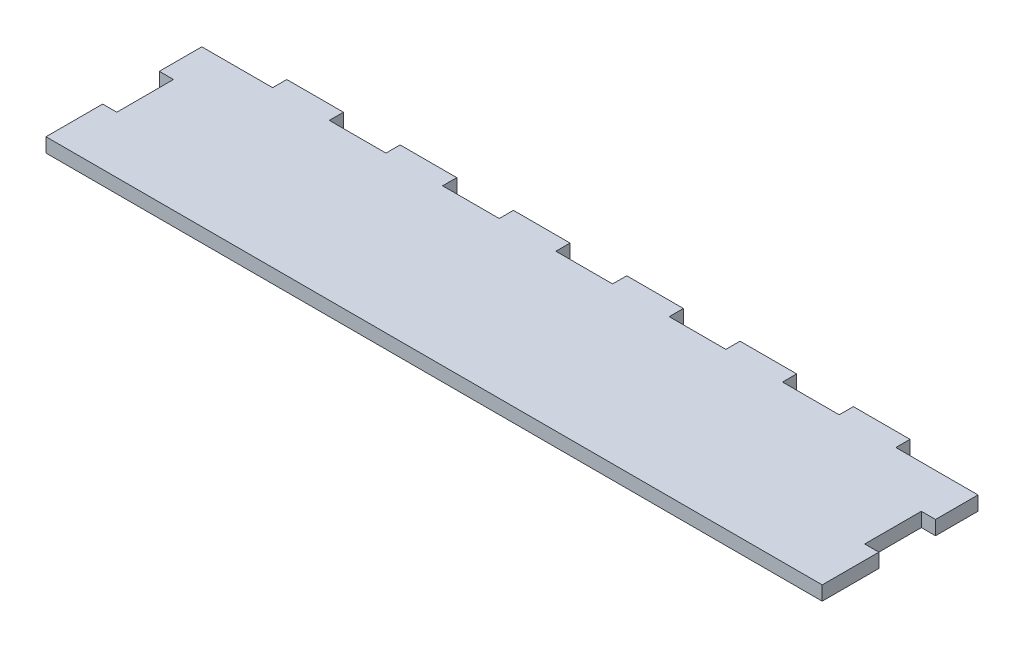
ISO-10303-21;
HEADER;
FILE_DESCRIPTION(('STEP AP214'),'2;1');
FILE_NAME('part.step','',(''),(''),'','','');
FILE_SCHEMA(('AUTOMOTIVE_DESIGN { 1 0 10303 214 1 1 1 1 }'));
ENDSEC;
DATA;
#1=APPLICATION_CONTEXT('core data for automotive mechanical design processes');
#2=APPLICATION_PROTOCOL_DEFINITION('international standard','automotive_design',2000,#1);
#3=PRODUCT_CONTEXT('',#1,'mechanical');
#4=PRODUCT('Part','Part','',(#3));
#5=PRODUCT_RELATED_PRODUCT_CATEGORY('part','',(#4));
#6=PRODUCT_DEFINITION_FORMATION('','',#4);
#7=PRODUCT_DEFINITION_CONTEXT('part definition',#1,'design');
#8=PRODUCT_DEFINITION('design','',#6,#7);
#9=PRODUCT_DEFINITION_SHAPE('','',#8);
#10=(LENGTH_UNIT() NAMED_UNIT(*) SI_UNIT(.MILLI.,.METRE.));
#11=(NAMED_UNIT(*) PLANE_ANGLE_UNIT() SI_UNIT($,.RADIAN.));
#12=(NAMED_UNIT(*) SI_UNIT($,.STERADIAN.) SOLID_ANGLE_UNIT());
#13=UNCERTAINTY_MEASURE_WITH_UNIT(LENGTH_MEASURE(1.E-05),#10,'distance_accuracy_value','');
#14=(GEOMETRIC_REPRESENTATION_CONTEXT(3) GLOBAL_UNCERTAINTY_ASSIGNED_CONTEXT((#13)) GLOBAL_UNIT_ASSIGNED_CONTEXT((#10,
#11,#12)) REPRESENTATION_CONTEXT('',''));
#15=CARTESIAN_POINT('',(0.,0.,0.));
#16=DIRECTION('',(0.,0.,1.));
#17=DIRECTION('',(1.,0.,0.));
#18=AXIS2_PLACEMENT_3D('',#15,#16,#17);
#19=CARTESIAN_POINT('',(86.995,3.175,19.05));
#20=DIRECTION('',(-1.,0.,0.));
#21=DIRECTION('',(0.,0.,1.));
#22=AXIS2_PLACEMENT_3D('',#19,#20,#21);
#23=PLANE('',#22);
#24=DIRECTION('',(0.,0.,-1.));
#25=VECTOR('',#24,1.);
#26=CARTESIAN_POINT('',(86.995,0.,19.05));
#27=LINE('',#26,#25);
#28=CARTESIAN_POINT('',(86.995,0.,19.05));
#29=VERTEX_POINT('',#28);
#30=CARTESIAN_POINT('',(86.995,0.,6.35));
#31=VERTEX_POINT('',#30);
#32=EDGE_CURVE('E305',#29,#31,#27,.T.);
#33=ORIENTED_EDGE('',*,*,#32,.T.);
#34=DIRECTION('',(0.,1.,0.));
#35=VECTOR('',#34,1.);
#36=CARTESIAN_POINT('',(86.995,0.,6.35));
#37=LINE('',#36,#35);
#38=CARTESIAN_POINT('',(86.995,3.175,6.35));
#39=VERTEX_POINT('',#38);
#40=EDGE_CURVE('E449',#31,#39,#37,.T.);
#41=ORIENTED_EDGE('',*,*,#40,.T.);
#42=DIRECTION('',(0.,0.,-1.));
#43=VECTOR('',#42,1.);
#44=CARTESIAN_POINT('',(86.995,3.175,19.05));
#45=LINE('',#44,#43);
#46=CARTESIAN_POINT('',(86.995,3.175,19.05));
#47=VERTEX_POINT('',#46);
#48=EDGE_CURVE('E333',#47,#39,#45,.T.);
#49=ORIENTED_EDGE('',*,*,#48,.F.);
#50=DIRECTION('',(0.,-1.,0.));
#51=VECTOR('',#50,1.);
#52=CARTESIAN_POINT('',(86.995,3.175,19.05));
#53=LINE('',#52,#51);
#54=EDGE_CURVE('E41',#47,#29,#53,.T.);
#55=ORIENTED_EDGE('',*,*,#54,.T.);
#56=EDGE_LOOP('',(#33,#41,#49,#55));
#57=FACE_BOUND('',#56,.T.);
#58=ADVANCED_FACE('F33',(#57),#23,.F.);
#59=CARTESIAN_POINT('',(-86.995,3.175,-19.05));
#60=DIRECTION('',(0.,0.,1.));
#61=DIRECTION('',(1.,0.,0.));
#62=AXIS2_PLACEMENT_3D('',#59,#60,#61);
#63=PLANE('',#62);
#64=DIRECTION('',(-1.,0.,0.));
#65=VECTOR('',#64,1.);
#66=CARTESIAN_POINT('',(-86.995,3.175,-19.05));
#67=LINE('',#66,#65);
#68=CARTESIAN_POINT('',(-58.42,3.175,-19.05));
#69=VERTEX_POINT('',#68);
#70=CARTESIAN_POINT('',(-71.12,3.175,-19.05));
#71=VERTEX_POINT('',#70);
#72=EDGE_CURVE('E329',#69,#71,#67,.T.);
#73=ORIENTED_EDGE('',*,*,#72,.F.);
#74=DIRECTION('',(0.,1.,0.));
#75=VECTOR('',#74,1.);
#76=CARTESIAN_POINT('',(-58.42,0.,-19.05));
#77=LINE('',#76,#75);
#78=CARTESIAN_POINT('',(-58.42,0.,-19.05));
#79=VERTEX_POINT('',#78);
#80=EDGE_CURVE('E350',#79,#69,#77,.T.);
#81=ORIENTED_EDGE('',*,*,#80,.F.);
#82=DIRECTION('',(-1.,0.,0.));
#83=VECTOR('',#82,1.);
#84=CARTESIAN_POINT('',(-86.995,0.,-19.05));
#85=LINE('',#84,#83);
#86=CARTESIAN_POINT('',(-71.12,0.,-19.05));
#87=VERTEX_POINT('',#86);
#88=EDGE_CURVE('E301',#79,#87,#85,.T.);
#89=ORIENTED_EDGE('',*,*,#88,.T.);
#90=DIRECTION('',(0.,1.,0.));
#91=VECTOR('',#90,1.);
#92=CARTESIAN_POINT('',(-71.12,0.,-19.05));
#93=LINE('',#92,#91);
#94=EDGE_CURVE('E340',#87,#71,#93,.T.);
#95=ORIENTED_EDGE('',*,*,#94,.T.);
#96=EDGE_LOOP('',(#73,#81,#89,#95));
#97=FACE_BOUND('',#96,.T.);
#98=ADVANCED_FACE('F574',(#97),#63,.F.);
#99=CARTESIAN_POINT('',(-7.61999999999998,0.,-19.05));
#100=VERTEX_POINT('',#99);
#101=CARTESIAN_POINT('',(-20.32,0.,-19.05));
#102=VERTEX_POINT('',#101);
#103=EDGE_CURVE('E284',#100,#102,#85,.T.);
#104=ORIENTED_EDGE('',*,*,#103,.T.);
#105=DIRECTION('',(0.,1.,0.));
#106=VECTOR('',#105,1.);
#107=CARTESIAN_POINT('',(-20.32,0.,-19.05));
#108=LINE('',#107,#106);
#109=CARTESIAN_POINT('',(-20.32,3.175,-19.05));
#110=VERTEX_POINT('',#109);
#111=EDGE_CURVE('E361',#102,#110,#108,.T.);
#112=ORIENTED_EDGE('',*,*,#111,.T.);
#113=CARTESIAN_POINT('',(-7.61999999999998,3.175,-19.05));
#114=VERTEX_POINT('',#113);
#115=EDGE_CURVE('E286',#114,#110,#67,.T.);
#116=ORIENTED_EDGE('',*,*,#115,.F.);
#117=DIRECTION('',(0.,1.,0.));
#118=VECTOR('',#117,1.);
#119=CARTESIAN_POINT('',(-7.61999999999998,0.,-19.05));
#120=LINE('',#119,#118);
#121=EDGE_CURVE('E270',#100,#114,#120,.T.);
#122=ORIENTED_EDGE('',*,*,#121,.F.);
#123=EDGE_LOOP('',(#104,#112,#116,#122));
#124=FACE_BOUND('',#123,.T.);
#125=ADVANCED_FACE('F282',(#124),#63,.F.);
#126=CARTESIAN_POINT('',(17.78,0.,-19.05));
#127=VERTEX_POINT('',#126);
#128=CARTESIAN_POINT('',(5.08000000000002,0.,-19.05));
#129=VERTEX_POINT('',#128);
#130=EDGE_CURVE('E295',#127,#129,#85,.T.);
#131=ORIENTED_EDGE('',*,*,#130,.T.);
#132=DIRECTION('',(0.,1.,0.));
#133=VECTOR('',#132,1.);
#134=CARTESIAN_POINT('',(5.08000000000002,0.,-19.05));
#135=LINE('',#134,#133);
#136=CARTESIAN_POINT('',(5.08000000000002,3.175,-19.05));
#137=VERTEX_POINT('',#136);
#138=EDGE_CURVE('E373',#129,#137,#135,.T.);
#139=ORIENTED_EDGE('',*,*,#138,.T.);
#140=CARTESIAN_POINT('',(17.78,3.175,-19.05));
#141=VERTEX_POINT('',#140);
#142=EDGE_CURVE('E546',#141,#137,#67,.T.);
#143=ORIENTED_EDGE('',*,*,#142,.F.);
#144=DIRECTION('',(0.,1.,0.));
#145=VECTOR('',#144,1.);
#146=CARTESIAN_POINT('',(17.78,0.,-19.05));
#147=LINE('',#146,#145);
#148=EDGE_CURVE('E495',#127,#141,#147,.T.);
#149=ORIENTED_EDGE('',*,*,#148,.F.);
#150=EDGE_LOOP('',(#131,#139,#143,#149));
#151=FACE_BOUND('',#150,.T.);
#152=ADVANCED_FACE('F544',(#151),#63,.F.);
#153=CARTESIAN_POINT('',(43.18,0.,-19.05));
#154=VERTEX_POINT('',#153);
#155=CARTESIAN_POINT('',(30.48,0.,-19.05));
#156=VERTEX_POINT('',#155);
#157=EDGE_CURVE('E299',#154,#156,#85,.T.);
#158=ORIENTED_EDGE('',*,*,#157,.T.);
#159=DIRECTION('',(0.,1.,0.));
#160=VECTOR('',#159,1.);
#161=CARTESIAN_POINT('',(30.48,0.,-19.05));
#162=LINE('',#161,#160);
#163=CARTESIAN_POINT('',(30.48,3.175,-19.05));
#164=VERTEX_POINT('',#163);
#165=EDGE_CURVE('E502',#156,#164,#162,.T.);
#166=ORIENTED_EDGE('',*,*,#165,.T.);
#167=CARTESIAN_POINT('',(43.18,3.175,-19.05));
#168=VERTEX_POINT('',#167);
#169=EDGE_CURVE('E551',#168,#164,#67,.T.);
#170=ORIENTED_EDGE('',*,*,#169,.F.);
#171=DIRECTION('',(0.,1.,0.));
#172=VECTOR('',#171,1.);
#173=CARTESIAN_POINT('',(43.18,0.,-19.05));
#174=LINE('',#173,#172);
#175=EDGE_CURVE('E469',#154,#168,#174,.T.);
#176=ORIENTED_EDGE('',*,*,#175,.F.);
#177=EDGE_LOOP('',(#158,#166,#170,#176));
#178=FACE_BOUND('',#177,.T.);
#179=ADVANCED_FACE('F652',(#178),#63,.F.);
#180=CARTESIAN_POINT('',(68.58,3.175,-19.05));
#181=VERTEX_POINT('',#180);
#182=CARTESIAN_POINT('',(55.88,3.175,-19.05));
#183=VERTEX_POINT('',#182);
#184=EDGE_CURVE('E328',#181,#183,#67,.T.);
#185=ORIENTED_EDGE('',*,*,#184,.F.);
#186=DIRECTION('',(0.,1.,0.));
#187=VECTOR('',#186,1.);
#188=CARTESIAN_POINT('',(68.58,0.,-19.05));
#189=LINE('',#188,#187);
#190=CARTESIAN_POINT('',(68.58,0.,-19.05));
#191=VERTEX_POINT('',#190);
#192=EDGE_CURVE('E379',#191,#181,#189,.T.);
#193=ORIENTED_EDGE('',*,*,#192,.F.);
#194=CARTESIAN_POINT('',(55.88,0.,-19.05));
#195=VERTEX_POINT('',#194);
#196=EDGE_CURVE('E306',#191,#195,#85,.T.);
#197=ORIENTED_EDGE('',*,*,#196,.T.);
#198=DIRECTION('',(0.,1.,0.));
#199=VECTOR('',#198,1.);
#200=CARTESIAN_POINT('',(55.88,0.,-19.05));
#201=LINE('',#200,#199);
#202=EDGE_CURVE('E476',#195,#183,#201,.T.);
#203=ORIENTED_EDGE('',*,*,#202,.T.);
#204=EDGE_LOOP('',(#185,#193,#197,#203));
#205=FACE_BOUND('',#204,.T.);
#206=ADVANCED_FACE('F634',(#205),#63,.F.);
#207=CARTESIAN_POINT('',(-86.995,3.175,19.05));
#208=DIRECTION('',(1.,0.,0.));
#209=DIRECTION('',(0.,0.,-1.));
#210=AXIS2_PLACEMENT_3D('',#207,#208,#209);
#211=PLANE('',#210);
#212=DIRECTION('',(0.,0.,1.));
#213=VECTOR('',#212,1.);
#214=CARTESIAN_POINT('',(-86.995,0.,19.05));
#215=LINE('',#214,#213);
#216=CARTESIAN_POINT('',(-86.995,0.,-15.875));
#217=VERTEX_POINT('',#216);
#218=CARTESIAN_POINT('',(-86.995,0.,-6.35));
#219=VERTEX_POINT('',#218);
#220=EDGE_CURVE('E310',#217,#219,#215,.T.);
#221=ORIENTED_EDGE('',*,*,#220,.T.);
#222=DIRECTION('',(0.,1.,0.));
#223=VECTOR('',#222,1.);
#224=CARTESIAN_POINT('',(-86.995,0.,-6.35));
#225=LINE('',#224,#223);
#226=CARTESIAN_POINT('',(-86.995,3.175,-6.35));
#227=VERTEX_POINT('',#226);
#228=EDGE_CURVE('E404',#219,#227,#225,.T.);
#229=ORIENTED_EDGE('',*,*,#228,.T.);
#230=DIRECTION('',(0.,0.,1.));
#231=VECTOR('',#230,1.);
#232=CARTESIAN_POINT('',(-86.995,3.175,19.05));
#233=LINE('',#232,#231);
#234=CARTESIAN_POINT('',(-86.995,3.175,-15.875));
#235=VERTEX_POINT('',#234);
#236=EDGE_CURVE('E320',#235,#227,#233,.T.);
#237=ORIENTED_EDGE('',*,*,#236,.F.);
#238=DIRECTION('',(0.,1.,0.));
#239=VECTOR('',#238,1.);
#240=CARTESIAN_POINT('',(-86.995,0.,-15.875));
#241=LINE('',#240,#239);
#242=EDGE_CURVE('E335',#217,#235,#241,.T.);
#243=ORIENTED_EDGE('',*,*,#242,.F.);
#244=EDGE_LOOP('',(#221,#229,#237,#243));
#245=FACE_BOUND('',#244,.T.);
#246=ADVANCED_FACE('F586',(#245),#211,.F.);
#247=CARTESIAN_POINT('',(86.995,0.,-6.35));
#248=VERTEX_POINT('',#247);
#249=CARTESIAN_POINT('',(86.995,0.,-15.875));
#250=VERTEX_POINT('',#249);
#251=EDGE_CURVE('E343',#248,#250,#27,.T.);
#252=ORIENTED_EDGE('',*,*,#251,.T.);
#253=DIRECTION('',(0.,1.,0.));
#254=VECTOR('',#253,1.);
#255=CARTESIAN_POINT('',(86.995,0.,-15.875));
#256=LINE('',#255,#254);
#257=CARTESIAN_POINT('',(86.995,3.175,-15.875));
#258=VERTEX_POINT('',#257);
#259=EDGE_CURVE('E384',#250,#258,#256,.T.);
#260=ORIENTED_EDGE('',*,*,#259,.T.);
#261=CARTESIAN_POINT('',(86.995,3.175,-6.35));
#262=VERTEX_POINT('',#261);
#263=EDGE_CURVE('E312',#262,#258,#45,.T.);
#264=ORIENTED_EDGE('',*,*,#263,.F.);
#265=DIRECTION('',(0.,1.,0.));
#266=VECTOR('',#265,1.);
#267=CARTESIAN_POINT('',(86.995,0.,-6.35));
#268=LINE('',#267,#266);
#269=EDGE_CURVE('E442',#248,#262,#268,.T.);
#270=ORIENTED_EDGE('',*,*,#269,.F.);
#271=EDGE_LOOP('',(#252,#260,#264,#270));
#272=FACE_BOUND('',#271,.T.);
#273=ADVANCED_FACE('F35',(#272),#23,.F.);
#274=CARTESIAN_POINT('',(-33.02,0.,-19.05));
#275=VERTEX_POINT('',#274);
#276=CARTESIAN_POINT('',(-45.72,0.,-19.05));
#277=VERTEX_POINT('',#276);
#278=EDGE_CURVE('E296',#275,#277,#85,.T.);
#279=ORIENTED_EDGE('',*,*,#278,.T.);
#280=DIRECTION('',(0.,1.,0.));
#281=VECTOR('',#280,1.);
#282=CARTESIAN_POINT('',(-45.72,0.,-19.05));
#283=LINE('',#282,#281);
#284=CARTESIAN_POINT('',(-45.72,3.175,-19.05));
#285=VERTEX_POINT('',#284);
#286=EDGE_CURVE('E425',#277,#285,#283,.T.);
#287=ORIENTED_EDGE('',*,*,#286,.T.);
#288=CARTESIAN_POINT('',(-33.02,3.175,-19.05));
#289=VERTEX_POINT('',#288);
#290=EDGE_CURVE('E332',#289,#285,#67,.T.);
#291=ORIENTED_EDGE('',*,*,#290,.F.);
#292=DIRECTION('',(0.,1.,0.));
#293=VECTOR('',#292,1.);
#294=CARTESIAN_POINT('',(-33.02,0.,-19.05));
#295=LINE('',#294,#293);
#296=EDGE_CURVE('E355',#275,#289,#295,.T.);
#297=ORIENTED_EDGE('',*,*,#296,.F.);
#298=EDGE_LOOP('',(#279,#287,#291,#297));
#299=FACE_BOUND('',#298,.T.);
#300=ADVANCED_FACE('F561',(#299),#63,.F.);
#301=CARTESIAN_POINT('',(-86.995,3.175,6.35));
#302=VERTEX_POINT('',#301);
#303=CARTESIAN_POINT('',(-86.995,3.175,19.05));
#304=VERTEX_POINT('',#303);
#305=EDGE_CURVE('E325',#302,#304,#233,.T.);
#306=ORIENTED_EDGE('',*,*,#305,.F.);
#307=DIRECTION('',(0.,1.,0.));
#308=VECTOR('',#307,1.);
#309=CARTESIAN_POINT('',(-86.995,0.,6.35));
#310=LINE('',#309,#308);
#311=CARTESIAN_POINT('',(-86.995,0.,6.35));
#312=VERTEX_POINT('',#311);
#313=EDGE_CURVE('E397',#312,#302,#310,.T.);
#314=ORIENTED_EDGE('',*,*,#313,.F.);
#315=CARTESIAN_POINT('',(-86.995,0.,19.05));
#316=VERTEX_POINT('',#315);
#317=EDGE_CURVE('E308',#312,#316,#215,.T.);
#318=ORIENTED_EDGE('',*,*,#317,.T.);
#319=DIRECTION('',(0.,-1.,0.));
#320=VECTOR('',#319,1.);
#321=CARTESIAN_POINT('',(-86.995,3.175,19.05));
#322=LINE('',#321,#320);
#323=EDGE_CURVE('E11',#304,#316,#322,.T.);
#324=ORIENTED_EDGE('',*,*,#323,.F.);
#325=EDGE_LOOP('',(#306,#314,#318,#324));
#326=FACE_BOUND('',#325,.T.);
#327=ADVANCED_FACE('F600',(#326),#211,.F.);
#328=CARTESIAN_POINT('',(-86.995,3.175,19.05));
#329=DIRECTION('',(0.,0.,-1.));
#330=DIRECTION('',(-1.,0.,0.));
#331=AXIS2_PLACEMENT_3D('',#328,#329,#330);
#332=PLANE('',#331);
#333=DIRECTION('',(1.,0.,0.));
#334=VECTOR('',#333,1.);
#335=CARTESIAN_POINT('',(-86.995,0.,19.05));
#336=LINE('',#335,#334);
#337=EDGE_CURVE('E311',#316,#29,#336,.T.);
#338=ORIENTED_EDGE('',*,*,#337,.T.);
#339=ORIENTED_EDGE('',*,*,#54,.F.);
#340=DIRECTION('',(1.,0.,0.));
#341=VECTOR('',#340,1.);
#342=CARTESIAN_POINT('',(-86.995,3.175,19.05));
#343=LINE('',#342,#341);
#344=EDGE_CURVE('E314',#304,#47,#343,.T.);
#345=ORIENTED_EDGE('',*,*,#344,.F.);
#346=ORIENTED_EDGE('',*,*,#323,.T.);
#347=EDGE_LOOP('',(#338,#339,#345,#346));
#348=FACE_BOUND('',#347,.T.);
#349=ADVANCED_FACE('F604',(#348),#332,.F.);
#350=CARTESIAN_POINT('',(0.,3.175,0.));
#351=DIRECTION('',(0.,-1.,0.));
#352=DIRECTION('',(0.,0.,-1.));
#353=AXIS2_PLACEMENT_3D('',#350,#351,#352);
#354=PLANE('',#353);
#355=DIRECTION('',(1.,0.,0.));
#356=VECTOR('',#355,1.);
#357=CARTESIAN_POINT('',(-58.42,3.175,-15.875));
#358=LINE('',#357,#356);
#359=CARTESIAN_POINT('',(-58.42,3.175,-15.875));
#360=VERTEX_POINT('',#359);
#361=CARTESIAN_POINT('',(-45.72,3.175,-15.875));
#362=VERTEX_POINT('',#361);
#363=EDGE_CURVE('E432',#360,#362,#358,.T.);
#364=ORIENTED_EDGE('',*,*,#363,.F.);
#365=DIRECTION('',(0.,0.,1.));
#366=VECTOR('',#365,1.);
#367=CARTESIAN_POINT('',(-58.42,3.175,-19.05));
#368=LINE('',#367,#366);
#369=EDGE_CURVE('E407',#69,#360,#368,.T.);
#370=ORIENTED_EDGE('',*,*,#369,.F.);
#371=ORIENTED_EDGE('',*,*,#72,.T.);
#372=DIRECTION('',(0.,0.,-1.));
#373=VECTOR('',#372,1.);
#374=CARTESIAN_POINT('',(-71.12,3.175,-19.05));
#375=LINE('',#374,#373);
#376=CARTESIAN_POINT('',(-71.12,3.175,-15.875));
#377=VERTEX_POINT('',#376);
#378=EDGE_CURVE('E344',#377,#71,#375,.T.);
#379=ORIENTED_EDGE('',*,*,#378,.F.);
#380=DIRECTION('',(1.,0.,0.));
#381=VECTOR('',#380,1.);
#382=CARTESIAN_POINT('',(-86.995,3.175,-15.875));
#383=LINE('',#382,#381);
#384=EDGE_CURVE('E347',#235,#377,#383,.T.);
#385=ORIENTED_EDGE('',*,*,#384,.F.);
#386=ORIENTED_EDGE('',*,*,#236,.T.);
#387=DIRECTION('',(-1.,0.,0.));
#388=VECTOR('',#387,1.);
#389=CARTESIAN_POINT('',(-86.995,3.175,-6.35));
#390=LINE('',#389,#388);
#391=CARTESIAN_POINT('',(-83.82,3.175,-6.35));
#392=VERTEX_POINT('',#391);
#393=EDGE_CURVE('E408',#392,#227,#390,.T.);
#394=ORIENTED_EDGE('',*,*,#393,.F.);
#395=DIRECTION('',(0.,0.,-1.));
#396=VECTOR('',#395,1.);
#397=CARTESIAN_POINT('',(-83.82,3.175,-6.35));
#398=LINE('',#397,#396);
#399=CARTESIAN_POINT('',(-83.82,3.175,6.35));
#400=VERTEX_POINT('',#399);
#401=EDGE_CURVE('E411',#400,#392,#398,.T.);
#402=ORIENTED_EDGE('',*,*,#401,.F.);
#403=DIRECTION('',(1.,0.,0.));
#404=VECTOR('',#403,1.);
#405=CARTESIAN_POINT('',(-86.995,3.175,6.35));
#406=LINE('',#405,#404);
#407=EDGE_CURVE('E387',#302,#400,#406,.T.);
#408=ORIENTED_EDGE('',*,*,#407,.F.);
#409=ORIENTED_EDGE('',*,*,#305,.T.);
#410=ORIENTED_EDGE('',*,*,#344,.T.);
#411=ORIENTED_EDGE('',*,*,#48,.T.);
#412=DIRECTION('',(1.,0.,0.));
#413=VECTOR('',#412,1.);
#414=CARTESIAN_POINT('',(86.995,3.175,6.35));
#415=LINE('',#414,#413);
#416=CARTESIAN_POINT('',(83.82,3.175,6.35));
#417=VERTEX_POINT('',#416);
#418=EDGE_CURVE('E453',#417,#39,#415,.T.);
#419=ORIENTED_EDGE('',*,*,#418,.F.);
#420=DIRECTION('',(0.,0.,1.));
#421=VECTOR('',#420,1.);
#422=CARTESIAN_POINT('',(83.82,3.175,-6.35));
#423=LINE('',#422,#421);
#424=CARTESIAN_POINT('',(83.82,3.175,-6.35));
#425=VERTEX_POINT('',#424);
#426=EDGE_CURVE('E456',#425,#417,#423,.T.);
#427=ORIENTED_EDGE('',*,*,#426,.F.);
#428=DIRECTION('',(-1.,0.,0.));
#429=VECTOR('',#428,1.);
#430=CARTESIAN_POINT('',(86.995,3.175,-6.35));
#431=LINE('',#430,#429);
#432=EDGE_CURVE('E459',#262,#425,#431,.T.);
#433=ORIENTED_EDGE('',*,*,#432,.F.);
#434=ORIENTED_EDGE('',*,*,#263,.T.);
#435=DIRECTION('',(1.,0.,0.));
#436=VECTOR('',#435,1.);
#437=CARTESIAN_POINT('',(86.995,3.175,-15.875));
#438=LINE('',#437,#436);
#439=CARTESIAN_POINT('',(68.58,3.175,-15.875));
#440=VERTEX_POINT('',#439);
#441=EDGE_CURVE('E388',#440,#258,#438,.T.);
#442=ORIENTED_EDGE('',*,*,#441,.F.);
#443=DIRECTION('',(0.,0.,1.));
#444=VECTOR('',#443,1.);
#445=CARTESIAN_POINT('',(68.58,3.175,-19.05));
#446=LINE('',#445,#444);
#447=EDGE_CURVE('E363',#181,#440,#446,.T.);
#448=ORIENTED_EDGE('',*,*,#447,.F.);
#449=ORIENTED_EDGE('',*,*,#184,.T.);
#450=DIRECTION('',(0.,0.,-1.));
#451=VECTOR('',#450,1.);
#452=CARTESIAN_POINT('',(55.88,3.175,-19.05));
#453=LINE('',#452,#451);
#454=CARTESIAN_POINT('',(55.88,3.175,-15.875));
#455=VERTEX_POINT('',#454);
#456=EDGE_CURVE('E480',#455,#183,#453,.T.);
#457=ORIENTED_EDGE('',*,*,#456,.F.);
#458=DIRECTION('',(1.,0.,0.));
#459=VECTOR('',#458,1.);
#460=CARTESIAN_POINT('',(43.18,3.175,-15.875));
#461=LINE('',#460,#459);
#462=CARTESIAN_POINT('',(43.18,3.175,-15.875));
#463=VERTEX_POINT('',#462);
#464=EDGE_CURVE('E483',#463,#455,#461,.T.);
#465=ORIENTED_EDGE('',*,*,#464,.F.);
#466=DIRECTION('',(0.,0.,1.));
#467=VECTOR('',#466,1.);
#468=CARTESIAN_POINT('',(43.18,3.175,-19.05));
#469=LINE('',#468,#467);
#470=EDGE_CURVE('E452',#168,#463,#469,.T.);
#471=ORIENTED_EDGE('',*,*,#470,.F.);
#472=ORIENTED_EDGE('',*,*,#169,.T.);
#473=DIRECTION('',(0.,0.,-1.));
#474=VECTOR('',#473,1.);
#475=CARTESIAN_POINT('',(30.48,3.175,-19.05));
#476=LINE('',#475,#474);
#477=CARTESIAN_POINT('',(30.48,3.175,-15.875));
#478=VERTEX_POINT('',#477);
#479=EDGE_CURVE('E506',#478,#164,#476,.T.);
#480=ORIENTED_EDGE('',*,*,#479,.F.);
#481=DIRECTION('',(1.,0.,0.));
#482=VECTOR('',#481,1.);
#483=CARTESIAN_POINT('',(17.78,3.175,-15.875));
#484=LINE('',#483,#482);
#485=CARTESIAN_POINT('',(17.78,3.175,-15.875));
#486=VERTEX_POINT('',#485);
#487=EDGE_CURVE('E509',#486,#478,#484,.T.);
#488=ORIENTED_EDGE('',*,*,#487,.F.);
#489=DIRECTION('',(0.,0.,1.));
#490=VECTOR('',#489,1.);
#491=CARTESIAN_POINT('',(17.78,3.175,-19.05));
#492=LINE('',#491,#490);
#493=EDGE_CURVE('E479',#141,#486,#492,.T.);
#494=ORIENTED_EDGE('',*,*,#493,.F.);
#495=ORIENTED_EDGE('',*,*,#142,.T.);
#496=DIRECTION('',(0.,0.,-1.));
#497=VECTOR('',#496,1.);
#498=CARTESIAN_POINT('',(5.08000000000002,3.175,-19.05));
#499=LINE('',#498,#497);
#500=CARTESIAN_POINT('',(5.08000000000002,3.175,-15.875));
#501=VERTEX_POINT('',#500);
#502=EDGE_CURVE('E277',#501,#137,#499,.T.);
#503=ORIENTED_EDGE('',*,*,#502,.F.);
#504=DIRECTION('',(1.,0.,0.));
#505=VECTOR('',#504,1.);
#506=CARTESIAN_POINT('',(-7.62,3.175,-15.875));
#507=LINE('',#506,#505);
#508=CARTESIAN_POINT('',(-7.62,3.175,-15.875));
#509=VERTEX_POINT('',#508);
#510=EDGE_CURVE('E527',#509,#501,#507,.T.);
#511=ORIENTED_EDGE('',*,*,#510,.F.);
#512=DIRECTION('',(0.,0.,1.));
#513=VECTOR('',#512,1.);
#514=CARTESIAN_POINT('',(-7.61999999999998,3.175,-19.05));
#515=LINE('',#514,#513);
#516=EDGE_CURVE('E505',#114,#509,#515,.T.);
#517=ORIENTED_EDGE('',*,*,#516,.F.);
#518=ORIENTED_EDGE('',*,*,#115,.T.);
#519=DIRECTION('',(0.,0.,-1.));
#520=VECTOR('',#519,1.);
#521=CARTESIAN_POINT('',(-20.32,3.175,-19.05));
#522=LINE('',#521,#520);
#523=CARTESIAN_POINT('',(-20.32,3.175,-15.875));
#524=VERTEX_POINT('',#523);
#525=EDGE_CURVE('E364',#524,#110,#522,.T.);
#526=ORIENTED_EDGE('',*,*,#525,.F.);
#527=DIRECTION('',(1.,0.,0.));
#528=VECTOR('',#527,1.);
#529=CARTESIAN_POINT('',(-33.02,3.175,-15.875));
#530=LINE('',#529,#528);
#531=CARTESIAN_POINT('',(-33.02,3.175,-15.875));
#532=VERTEX_POINT('',#531);
#533=EDGE_CURVE('E367',#532,#524,#530,.T.);
#534=ORIENTED_EDGE('',*,*,#533,.F.);
#535=DIRECTION('',(0.,0.,1.));
#536=VECTOR('',#535,1.);
#537=CARTESIAN_POINT('',(-33.02,3.175,-19.05));
#538=LINE('',#537,#536);
#539=EDGE_CURVE('E370',#289,#532,#538,.T.);
#540=ORIENTED_EDGE('',*,*,#539,.F.);
#541=ORIENTED_EDGE('',*,*,#290,.T.);
#542=DIRECTION('',(0.,0.,-1.));
#543=VECTOR('',#542,1.);
#544=CARTESIAN_POINT('',(-45.72,3.175,-19.05));
#545=LINE('',#544,#543);
#546=EDGE_CURVE('E429',#362,#285,#545,.T.);
#547=ORIENTED_EDGE('',*,*,#546,.F.);
#548=EDGE_LOOP('',(#364,#370,#371,#379,#385,#386,#394,#402,#408,#409,#410,#411,#419,#427,#433,
#434,#442,#448,#449,#457,#465,#471,#472,#480,#488,#494,#495,#503,#511,#517,#518,#526,#534,#540,
#541,#547));
#549=FACE_BOUND('',#548,.T.);
#550=ADVANCED_FACE('F549',(#549),#354,.F.);
#551=CARTESIAN_POINT('',(0.,0.,0.));
#552=DIRECTION('',(0.,-1.,0.));
#553=DIRECTION('',(0.,0.,-1.));
#554=AXIS2_PLACEMENT_3D('',#551,#552,#553);
#555=PLANE('',#554);
#556=DIRECTION('',(0.,0.,1.));
#557=VECTOR('',#556,1.);
#558=CARTESIAN_POINT('',(-58.42,0.,-19.05));
#559=LINE('',#558,#557);
#560=CARTESIAN_POINT('',(-58.42,0.,-15.875));
#561=VERTEX_POINT('',#560);
#562=EDGE_CURVE('E431',#79,#561,#559,.T.);
#563=ORIENTED_EDGE('',*,*,#562,.T.);
#564=DIRECTION('',(1.,0.,0.));
#565=VECTOR('',#564,1.);
#566=CARTESIAN_POINT('',(-58.42,0.,-15.875));
#567=LINE('',#566,#565);
#568=CARTESIAN_POINT('',(-45.72,0.,-15.875));
#569=VERTEX_POINT('',#568);
#570=EDGE_CURVE('E438',#561,#569,#567,.T.);
#571=ORIENTED_EDGE('',*,*,#570,.T.);
#572=DIRECTION('',(0.,0.,-1.));
#573=VECTOR('',#572,1.);
#574=CARTESIAN_POINT('',(-45.72,0.,-19.05));
#575=LINE('',#574,#573);
#576=EDGE_CURVE('E48',#569,#277,#575,.T.);
#577=ORIENTED_EDGE('',*,*,#576,.T.);
#578=ORIENTED_EDGE('',*,*,#278,.F.);
#579=DIRECTION('',(0.,0.,1.));
#580=VECTOR('',#579,1.);
#581=CARTESIAN_POINT('',(-33.02,0.,-19.05));
#582=LINE('',#581,#580);
#583=CARTESIAN_POINT('',(-33.02,0.,-15.875));
#584=VERTEX_POINT('',#583);
#585=EDGE_CURVE('E366',#275,#584,#582,.T.);
#586=ORIENTED_EDGE('',*,*,#585,.T.);
#587=DIRECTION('',(1.,0.,0.));
#588=VECTOR('',#587,1.);
#589=CARTESIAN_POINT('',(-33.02,0.,-15.875));
#590=LINE('',#589,#588);
#591=CARTESIAN_POINT('',(-20.32,0.,-15.875));
#592=VERTEX_POINT('',#591);
#593=EDGE_CURVE('E375',#584,#592,#590,.T.);
#594=ORIENTED_EDGE('',*,*,#593,.T.);
#595=DIRECTION('',(0.,0.,-1.));
#596=VECTOR('',#595,1.);
#597=CARTESIAN_POINT('',(-20.32,0.,-19.05));
#598=LINE('',#597,#596);
#599=EDGE_CURVE('E294',#592,#102,#598,.T.);
#600=ORIENTED_EDGE('',*,*,#599,.T.);
#601=ORIENTED_EDGE('',*,*,#103,.F.);
#602=DIRECTION('',(0.,0.,1.));
#603=VECTOR('',#602,1.);
#604=CARTESIAN_POINT('',(-7.61999999999998,0.,-19.05));
#605=LINE('',#604,#603);
#606=CARTESIAN_POINT('',(-7.62,0.,-15.875));
#607=VERTEX_POINT('',#606);
#608=EDGE_CURVE('E266',#100,#607,#605,.T.);
#609=ORIENTED_EDGE('',*,*,#608,.T.);
#610=DIRECTION('',(1.,0.,0.));
#611=VECTOR('',#610,1.);
#612=CARTESIAN_POINT('',(-7.62,0.,-15.875));
#613=LINE('',#612,#611);
#614=CARTESIAN_POINT('',(5.08000000000002,0.,-15.875));
#615=VERTEX_POINT('',#614);
#616=EDGE_CURVE('E276',#607,#615,#613,.T.);
#617=ORIENTED_EDGE('',*,*,#616,.T.);
#618=DIRECTION('',(0.,0.,-1.));
#619=VECTOR('',#618,1.);
#620=CARTESIAN_POINT('',(5.08000000000002,0.,-19.05));
#621=LINE('',#620,#619);
#622=EDGE_CURVE('E287',#615,#129,#621,.T.);
#623=ORIENTED_EDGE('',*,*,#622,.T.);
#624=ORIENTED_EDGE('',*,*,#130,.F.);
#625=DIRECTION('',(0.,0.,1.));
#626=VECTOR('',#625,1.);
#627=CARTESIAN_POINT('',(17.78,0.,-19.05));
#628=LINE('',#627,#626);
#629=CARTESIAN_POINT('',(17.78,0.,-15.875));
#630=VERTEX_POINT('',#629);
#631=EDGE_CURVE('E508',#127,#630,#628,.T.);
#632=ORIENTED_EDGE('',*,*,#631,.T.);
#633=DIRECTION('',(1.,0.,0.));
#634=VECTOR('',#633,1.);
#635=CARTESIAN_POINT('',(17.78,0.,-15.875));
#636=LINE('',#635,#634);
#637=CARTESIAN_POINT('',(30.48,0.,-15.875));
#638=VERTEX_POINT('',#637);
#639=EDGE_CURVE('E516',#630,#638,#636,.T.);
#640=ORIENTED_EDGE('',*,*,#639,.T.);
#641=DIRECTION('',(0.,0.,-1.));
#642=VECTOR('',#641,1.);
#643=CARTESIAN_POINT('',(30.48,0.,-19.05));
#644=LINE('',#643,#642);
#645=EDGE_CURVE('E498',#638,#156,#644,.T.);
#646=ORIENTED_EDGE('',*,*,#645,.T.);
#647=ORIENTED_EDGE('',*,*,#157,.F.);
#648=DIRECTION('',(0.,0.,1.));
#649=VECTOR('',#648,1.);
#650=CARTESIAN_POINT('',(43.18,0.,-19.05));
#651=LINE('',#650,#649);
#652=CARTESIAN_POINT('',(43.18,0.,-15.875));
#653=VERTEX_POINT('',#652);
#654=EDGE_CURVE('E482',#154,#653,#651,.T.);
#655=ORIENTED_EDGE('',*,*,#654,.T.);
#656=DIRECTION('',(1.,0.,0.));
#657=VECTOR('',#656,1.);
#658=CARTESIAN_POINT('',(43.18,0.,-15.875));
#659=LINE('',#658,#657);
#660=CARTESIAN_POINT('',(55.88,0.,-15.875));
#661=VERTEX_POINT('',#660);
#662=EDGE_CURVE('E490',#653,#661,#659,.T.);
#663=ORIENTED_EDGE('',*,*,#662,.T.);
#664=DIRECTION('',(0.,0.,-1.));
#665=VECTOR('',#664,1.);
#666=CARTESIAN_POINT('',(55.88,0.,-19.05));
#667=LINE('',#666,#665);
#668=EDGE_CURVE('E472',#661,#195,#667,.T.);
#669=ORIENTED_EDGE('',*,*,#668,.T.);
#670=ORIENTED_EDGE('',*,*,#196,.F.);
#671=DIRECTION('',(0.,0.,1.));
#672=VECTOR('',#671,1.);
#673=CARTESIAN_POINT('',(68.58,0.,-19.05));
#674=LINE('',#673,#672);
#675=CARTESIAN_POINT('',(68.58,0.,-15.875));
#676=VERTEX_POINT('',#675);
#677=EDGE_CURVE('E390',#191,#676,#674,.T.);
#678=ORIENTED_EDGE('',*,*,#677,.T.);
#679=DIRECTION('',(1.,0.,0.));
#680=VECTOR('',#679,1.);
#681=CARTESIAN_POINT('',(68.58,0.,-15.875));
#682=LINE('',#681,#680);
#683=EDGE_CURVE('E382',#676,#250,#682,.T.);
#684=ORIENTED_EDGE('',*,*,#683,.T.);
#685=ORIENTED_EDGE('',*,*,#251,.F.);
#686=DIRECTION('',(-1.,0.,0.));
#687=VECTOR('',#686,1.);
#688=CARTESIAN_POINT('',(86.995,0.,-6.35));
#689=LINE('',#688,#687);
#690=CARTESIAN_POINT('',(83.82,0.,-6.35));
#691=VERTEX_POINT('',#690);
#692=EDGE_CURVE('E455',#248,#691,#689,.T.);
#693=ORIENTED_EDGE('',*,*,#692,.T.);
#694=DIRECTION('',(0.,0.,1.));
#695=VECTOR('',#694,1.);
#696=CARTESIAN_POINT('',(83.82,0.,-6.35));
#697=LINE('',#696,#695);
#698=CARTESIAN_POINT('',(83.82,0.,6.35));
#699=VERTEX_POINT('',#698);
#700=EDGE_CURVE('E464',#691,#699,#697,.T.);
#701=ORIENTED_EDGE('',*,*,#700,.T.);
#702=DIRECTION('',(1.,0.,0.));
#703=VECTOR('',#702,1.);
#704=CARTESIAN_POINT('',(86.995,0.,6.35));
#705=LINE('',#704,#703);
#706=EDGE_CURVE('E445',#699,#31,#705,.T.);
#707=ORIENTED_EDGE('',*,*,#706,.T.);
#708=ORIENTED_EDGE('',*,*,#32,.F.);
#709=ORIENTED_EDGE('',*,*,#337,.F.);
#710=ORIENTED_EDGE('',*,*,#317,.F.);
#711=DIRECTION('',(1.,0.,0.));
#712=VECTOR('',#711,1.);
#713=CARTESIAN_POINT('',(-86.995,0.,6.35));
#714=LINE('',#713,#712);
#715=CARTESIAN_POINT('',(-83.82,0.,6.35));
#716=VERTEX_POINT('',#715);
#717=EDGE_CURVE('E410',#312,#716,#714,.T.);
#718=ORIENTED_EDGE('',*,*,#717,.T.);
#719=DIRECTION('',(0.,0.,-1.));
#720=VECTOR('',#719,1.);
#721=CARTESIAN_POINT('',(-83.82,0.,-6.35));
#722=LINE('',#721,#720);
#723=CARTESIAN_POINT('',(-83.82,0.,-6.35));
#724=VERTEX_POINT('',#723);
#725=EDGE_CURVE('E56',#716,#724,#722,.T.);
#726=ORIENTED_EDGE('',*,*,#725,.T.);
#727=DIRECTION('',(-1.,0.,0.));
#728=VECTOR('',#727,1.);
#729=CARTESIAN_POINT('',(-86.995,0.,-6.35));
#730=LINE('',#729,#728);
#731=EDGE_CURVE('E400',#724,#219,#730,.T.);
#732=ORIENTED_EDGE('',*,*,#731,.T.);
#733=ORIENTED_EDGE('',*,*,#220,.F.);
#734=DIRECTION('',(1.,0.,0.));
#735=VECTOR('',#734,1.);
#736=CARTESIAN_POINT('',(-86.995,0.,-15.875));
#737=LINE('',#736,#735);
#738=CARTESIAN_POINT('',(-71.12,0.,-15.875));
#739=VERTEX_POINT('',#738);
#740=EDGE_CURVE('E346',#217,#739,#737,.T.);
#741=ORIENTED_EDGE('',*,*,#740,.T.);
#742=DIRECTION('',(0.,0.,-1.));
#743=VECTOR('',#742,1.);
#744=CARTESIAN_POINT('',(-71.12,0.,-19.05));
#745=LINE('',#744,#743);
#746=EDGE_CURVE('E338',#739,#87,#745,.T.);
#747=ORIENTED_EDGE('',*,*,#746,.T.);
#748=ORIENTED_EDGE('',*,*,#88,.F.);
#749=EDGE_LOOP('',(#563,#571,#577,#578,#586,#594,#600,#601,#609,#617,#623,#624,#632,#640,#646,
#647,#655,#663,#669,#670,#678,#684,#685,#693,#701,#707,#708,#709,#710,#718,#726,#732,#733,#741,
#747,#748));
#750=FACE_BOUND('',#749,.T.);
#751=ADVANCED_FACE('F291',(#750),#555,.T.);
#752=CARTESIAN_POINT('',(-71.12,0.,-19.05));
#753=DIRECTION('',(1.,0.,0.));
#754=DIRECTION('',(0.,0.,-1.));
#755=AXIS2_PLACEMENT_3D('',#752,#753,#754);
#756=PLANE('',#755);
#757=ORIENTED_EDGE('',*,*,#378,.T.);
#758=ORIENTED_EDGE('',*,*,#94,.F.);
#759=ORIENTED_EDGE('',*,*,#746,.F.);
#760=DIRECTION('',(0.,1.,0.));
#761=VECTOR('',#760,1.);
#762=CARTESIAN_POINT('',(-71.12,0.,-15.875));
#763=LINE('',#762,#761);
#764=EDGE_CURVE('E337',#739,#377,#763,.T.);
#765=ORIENTED_EDGE('',*,*,#764,.T.);
#766=EDGE_LOOP('',(#757,#758,#759,#765));
#767=FACE_BOUND('',#766,.T.);
#768=ADVANCED_FACE('F576',(#767),#756,.F.);
#769=CARTESIAN_POINT('',(-86.995,0.,-15.875));
#770=DIRECTION('',(0.,0.,1.));
#771=DIRECTION('',(1.,0.,0.));
#772=AXIS2_PLACEMENT_3D('',#769,#770,#771);
#773=PLANE('',#772);
#774=ORIENTED_EDGE('',*,*,#384,.T.);
#775=ORIENTED_EDGE('',*,*,#764,.F.);
#776=ORIENTED_EDGE('',*,*,#740,.F.);
#777=ORIENTED_EDGE('',*,*,#242,.T.);
#778=EDGE_LOOP('',(#774,#775,#776,#777));
#779=FACE_BOUND('',#778,.T.);
#780=ADVANCED_FACE('F582',(#779),#773,.F.);
#781=CARTESIAN_POINT('',(86.995,0.,6.35));
#782=DIRECTION('',(0.,0.,1.));
#783=DIRECTION('',(1.,0.,0.));
#784=AXIS2_PLACEMENT_3D('',#781,#782,#783);
#785=PLANE('',#784);
#786=ORIENTED_EDGE('',*,*,#418,.T.);
#787=ORIENTED_EDGE('',*,*,#40,.F.);
#788=ORIENTED_EDGE('',*,*,#706,.F.);
#789=DIRECTION('',(0.,1.,0.));
#790=VECTOR('',#789,1.);
#791=CARTESIAN_POINT('',(83.82,0.,6.35));
#792=LINE('',#791,#790);
#793=EDGE_CURVE('E447',#699,#417,#792,.T.);
#794=ORIENTED_EDGE('',*,*,#793,.T.);
#795=EDGE_LOOP('',(#786,#787,#788,#794));
#796=FACE_BOUND('',#795,.T.);
#797=ADVANCED_FACE('F609',(#796),#785,.F.);
#798=CARTESIAN_POINT('',(83.82,0.,-6.35));
#799=DIRECTION('',(-1.,0.,0.));
#800=DIRECTION('',(0.,0.,1.));
#801=AXIS2_PLACEMENT_3D('',#798,#799,#800);
#802=PLANE('',#801);
#803=ORIENTED_EDGE('',*,*,#426,.T.);
#804=ORIENTED_EDGE('',*,*,#793,.F.);
#805=ORIENTED_EDGE('',*,*,#700,.F.);
#806=DIRECTION('',(0.,1.,0.));
#807=VECTOR('',#806,1.);
#808=CARTESIAN_POINT('',(83.82,0.,-6.35));
#809=LINE('',#808,#807);
#810=EDGE_CURVE('E444',#691,#425,#809,.T.);
#811=ORIENTED_EDGE('',*,*,#810,.T.);
#812=EDGE_LOOP('',(#803,#804,#805,#811));
#813=FACE_BOUND('',#812,.T.);
#814=ADVANCED_FACE('F612',(#813),#802,.F.);
#815=CARTESIAN_POINT('',(86.995,0.,-6.35));
#816=DIRECTION('',(0.,0.,-1.));
#817=DIRECTION('',(-1.,0.,0.));
#818=AXIS2_PLACEMENT_3D('',#815,#816,#817);
#819=PLANE('',#818);
#820=ORIENTED_EDGE('',*,*,#432,.T.);
#821=ORIENTED_EDGE('',*,*,#810,.F.);
#822=ORIENTED_EDGE('',*,*,#692,.F.);
#823=ORIENTED_EDGE('',*,*,#269,.T.);
#824=EDGE_LOOP('',(#820,#821,#822,#823));
#825=FACE_BOUND('',#824,.T.);
#826=ADVANCED_FACE('F615',(#825),#819,.F.);
#827=CARTESIAN_POINT('',(55.88,0.,-19.05));
#828=DIRECTION('',(1.,0.,0.));
#829=DIRECTION('',(0.,0.,-1.));
#830=AXIS2_PLACEMENT_3D('',#827,#828,#829);
#831=PLANE('',#830);
#832=ORIENTED_EDGE('',*,*,#456,.T.);
#833=ORIENTED_EDGE('',*,*,#202,.F.);
#834=ORIENTED_EDGE('',*,*,#668,.F.);
#835=DIRECTION('',(0.,1.,0.));
#836=VECTOR('',#835,1.);
#837=CARTESIAN_POINT('',(55.88,0.,-15.875));
#838=LINE('',#837,#836);
#839=EDGE_CURVE('E474',#661,#455,#838,.T.);
#840=ORIENTED_EDGE('',*,*,#839,.T.);
#841=EDGE_LOOP('',(#832,#833,#834,#840));
#842=FACE_BOUND('',#841,.T.);
#843=ADVANCED_FACE('F640',(#842),#831,.F.);
#844=CARTESIAN_POINT('',(43.18,0.,-15.875));
#845=DIRECTION('',(0.,0.,1.));
#846=DIRECTION('',(1.,0.,0.));
#847=AXIS2_PLACEMENT_3D('',#844,#845,#846);
#848=PLANE('',#847);
#849=ORIENTED_EDGE('',*,*,#464,.T.);
#850=ORIENTED_EDGE('',*,*,#839,.F.);
#851=ORIENTED_EDGE('',*,*,#662,.F.);
#852=DIRECTION('',(0.,1.,0.));
#853=VECTOR('',#852,1.);
#854=CARTESIAN_POINT('',(43.18,0.,-15.875));
#855=LINE('',#854,#853);
#856=EDGE_CURVE('E471',#653,#463,#855,.T.);
#857=ORIENTED_EDGE('',*,*,#856,.T.);
#858=EDGE_LOOP('',(#849,#850,#851,#857));
#859=FACE_BOUND('',#858,.T.);
#860=ADVANCED_FACE('F643',(#859),#848,.F.);
#861=CARTESIAN_POINT('',(43.18,0.,-19.05));
#862=DIRECTION('',(-1.,0.,0.));
#863=DIRECTION('',(0.,0.,1.));
#864=AXIS2_PLACEMENT_3D('',#861,#862,#863);
#865=PLANE('',#864);
#866=ORIENTED_EDGE('',*,*,#470,.T.);
#867=ORIENTED_EDGE('',*,*,#856,.F.);
#868=ORIENTED_EDGE('',*,*,#654,.F.);
#869=ORIENTED_EDGE('',*,*,#175,.T.);
#870=EDGE_LOOP('',(#866,#867,#868,#869));
#871=FACE_BOUND('',#870,.T.);
#872=ADVANCED_FACE('F646',(#871),#865,.F.);
#873=CARTESIAN_POINT('',(30.48,0.,-19.05));
#874=DIRECTION('',(1.,0.,0.));
#875=DIRECTION('',(0.,0.,-1.));
#876=AXIS2_PLACEMENT_3D('',#873,#874,#875);
#877=PLANE('',#876);
#878=ORIENTED_EDGE('',*,*,#479,.T.);
#879=ORIENTED_EDGE('',*,*,#165,.F.);
#880=ORIENTED_EDGE('',*,*,#645,.F.);
#881=DIRECTION('',(0.,1.,0.));
#882=VECTOR('',#881,1.);
#883=CARTESIAN_POINT('',(30.48,0.,-15.875));
#884=LINE('',#883,#882);
#885=EDGE_CURVE('E500',#638,#478,#884,.T.);
#886=ORIENTED_EDGE('',*,*,#885,.T.);
#887=EDGE_LOOP('',(#878,#879,#880,#886));
#888=FACE_BOUND('',#887,.T.);
#889=ADVANCED_FACE('F656',(#888),#877,.F.);
#890=CARTESIAN_POINT('',(17.78,0.,-15.875));
#891=DIRECTION('',(0.,0.,1.));
#892=DIRECTION('',(1.,0.,0.));
#893=AXIS2_PLACEMENT_3D('',#890,#891,#892);
#894=PLANE('',#893);
#895=ORIENTED_EDGE('',*,*,#487,.T.);
#896=ORIENTED_EDGE('',*,*,#885,.F.);
#897=ORIENTED_EDGE('',*,*,#639,.F.);
#898=DIRECTION('',(0.,1.,0.));
#899=VECTOR('',#898,1.);
#900=CARTESIAN_POINT('',(17.78,0.,-15.875));
#901=LINE('',#900,#899);
#902=EDGE_CURVE('E497',#630,#486,#901,.T.);
#903=ORIENTED_EDGE('',*,*,#902,.T.);
#904=EDGE_LOOP('',(#895,#896,#897,#903));
#905=FACE_BOUND('',#904,.T.);
#906=ADVANCED_FACE('F659',(#905),#894,.F.);
#907=CARTESIAN_POINT('',(17.78,0.,-19.05));
#908=DIRECTION('',(-1.,0.,0.));
#909=DIRECTION('',(0.,0.,1.));
#910=AXIS2_PLACEMENT_3D('',#907,#908,#909);
#911=PLANE('',#910);
#912=ORIENTED_EDGE('',*,*,#493,.T.);
#913=ORIENTED_EDGE('',*,*,#902,.F.);
#914=ORIENTED_EDGE('',*,*,#631,.F.);
#915=ORIENTED_EDGE('',*,*,#148,.T.);
#916=EDGE_LOOP('',(#912,#913,#914,#915));
#917=FACE_BOUND('',#916,.T.);
#918=ADVANCED_FACE('F661',(#917),#911,.F.);
#919=CARTESIAN_POINT('',(5.08000000000002,0.,-19.05));
#920=DIRECTION('',(1.,0.,0.));
#921=DIRECTION('',(0.,0.,-1.));
#922=AXIS2_PLACEMENT_3D('',#919,#920,#921);
#923=PLANE('',#922);
#924=ORIENTED_EDGE('',*,*,#502,.T.);
#925=ORIENTED_EDGE('',*,*,#138,.F.);
#926=ORIENTED_EDGE('',*,*,#622,.F.);
#927=DIRECTION('',(0.,1.,0.));
#928=VECTOR('',#927,1.);
#929=CARTESIAN_POINT('',(5.08000000000002,0.,-15.875));
#930=LINE('',#929,#928);
#931=EDGE_CURVE('E522',#615,#501,#930,.T.);
#932=ORIENTED_EDGE('',*,*,#931,.T.);
#933=EDGE_LOOP('',(#924,#925,#926,#932));
#934=FACE_BOUND('',#933,.T.);
#935=ADVANCED_FACE('F540',(#934),#923,.F.);
#936=CARTESIAN_POINT('',(-7.62,0.,-15.875));
#937=DIRECTION('',(0.,0.,1.));
#938=DIRECTION('',(1.,0.,0.));
#939=AXIS2_PLACEMENT_3D('',#936,#937,#938);
#940=PLANE('',#939);
#941=ORIENTED_EDGE('',*,*,#510,.T.);
#942=ORIENTED_EDGE('',*,*,#931,.F.);
#943=ORIENTED_EDGE('',*,*,#616,.F.);
#944=DIRECTION('',(0.,1.,0.));
#945=VECTOR('',#944,1.);
#946=CARTESIAN_POINT('',(-7.62,0.,-15.875));
#947=LINE('',#946,#945);
#948=EDGE_CURVE('E272',#607,#509,#947,.T.);
#949=ORIENTED_EDGE('',*,*,#948,.T.);
#950=EDGE_LOOP('',(#941,#942,#943,#949));
#951=FACE_BOUND('',#950,.T.);
#952=ADVANCED_FACE('F536',(#951),#940,.F.);
#953=CARTESIAN_POINT('',(-7.61999999999998,0.,-19.05));
#954=DIRECTION('',(-1.,0.,0.));
#955=DIRECTION('',(0.,0.,1.));
#956=AXIS2_PLACEMENT_3D('',#953,#954,#955);
#957=PLANE('',#956);
#958=ORIENTED_EDGE('',*,*,#516,.T.);
#959=ORIENTED_EDGE('',*,*,#948,.F.);
#960=ORIENTED_EDGE('',*,*,#608,.F.);
#961=ORIENTED_EDGE('',*,*,#121,.T.);
#962=EDGE_LOOP('',(#958,#959,#960,#961));
#963=FACE_BOUND('',#962,.T.);
#964=ADVANCED_FACE('F269',(#963),#957,.F.);
#965=CARTESIAN_POINT('',(-20.32,0.,-19.05));
#966=DIRECTION('',(1.,0.,0.));
#967=DIRECTION('',(0.,0.,-1.));
#968=AXIS2_PLACEMENT_3D('',#965,#966,#967);
#969=PLANE('',#968);
#970=ORIENTED_EDGE('',*,*,#525,.T.);
#971=ORIENTED_EDGE('',*,*,#111,.F.);
#972=ORIENTED_EDGE('',*,*,#599,.F.);
#973=DIRECTION('',(0.,1.,0.));
#974=VECTOR('',#973,1.);
#975=CARTESIAN_POINT('',(-20.32,0.,-15.875));
#976=LINE('',#975,#974);
#977=EDGE_CURVE('E359',#592,#524,#976,.T.);
#978=ORIENTED_EDGE('',*,*,#977,.T.);
#979=EDGE_LOOP('',(#970,#971,#972,#978));
#980=FACE_BOUND('',#979,.T.);
#981=ADVANCED_FACE('F707',(#980),#969,.F.);
#982=CARTESIAN_POINT('',(-33.02,0.,-15.875));
#983=DIRECTION('',(0.,0.,1.));
#984=DIRECTION('',(1.,0.,0.));
#985=AXIS2_PLACEMENT_3D('',#982,#983,#984);
#986=PLANE('',#985);
#987=ORIENTED_EDGE('',*,*,#533,.T.);
#988=ORIENTED_EDGE('',*,*,#977,.F.);
#989=ORIENTED_EDGE('',*,*,#593,.F.);
#990=DIRECTION('',(0.,1.,0.));
#991=VECTOR('',#990,1.);
#992=CARTESIAN_POINT('',(-33.02,0.,-15.875));
#993=LINE('',#992,#991);
#994=EDGE_CURVE('E357',#584,#532,#993,.T.);
#995=ORIENTED_EDGE('',*,*,#994,.T.);
#996=EDGE_LOOP('',(#987,#988,#989,#995));
#997=FACE_BOUND('',#996,.T.);
#998=ADVANCED_FACE('F703',(#997),#986,.F.);
#999=CARTESIAN_POINT('',(-33.02,0.,-19.05));
#1000=DIRECTION('',(-1.,0.,0.));
#1001=DIRECTION('',(0.,0.,1.));
#1002=AXIS2_PLACEMENT_3D('',#999,#1000,#1001);
#1003=PLANE('',#1002);
#1004=ORIENTED_EDGE('',*,*,#539,.T.);
#1005=ORIENTED_EDGE('',*,*,#994,.F.);
#1006=ORIENTED_EDGE('',*,*,#585,.F.);
#1007=ORIENTED_EDGE('',*,*,#296,.T.);
#1008=EDGE_LOOP('',(#1004,#1005,#1006,#1007));
#1009=FACE_BOUND('',#1008,.T.);
#1010=ADVANCED_FACE('F700',(#1009),#1003,.F.);
#1011=CARTESIAN_POINT('',(86.995,0.,-15.875));
#1012=DIRECTION('',(0.,0.,1.));
#1013=DIRECTION('',(1.,0.,0.));
#1014=AXIS2_PLACEMENT_3D('',#1011,#1012,#1013);
#1015=PLANE('',#1014);
#1016=ORIENTED_EDGE('',*,*,#441,.T.);
#1017=ORIENTED_EDGE('',*,*,#259,.F.);
#1018=ORIENTED_EDGE('',*,*,#683,.F.);
#1019=DIRECTION('',(0.,1.,0.));
#1020=VECTOR('',#1019,1.);
#1021=CARTESIAN_POINT('',(68.58,0.,-15.875));
#1022=LINE('',#1021,#1020);
#1023=EDGE_CURVE('E381',#676,#440,#1022,.T.);
#1024=ORIENTED_EDGE('',*,*,#1023,.T.);
#1025=EDGE_LOOP('',(#1016,#1017,#1018,#1024));
#1026=FACE_BOUND('',#1025,.T.);
#1027=ADVANCED_FACE('F624',(#1026),#1015,.F.);
#1028=CARTESIAN_POINT('',(68.58,0.,-19.05));
#1029=DIRECTION('',(-1.,0.,0.));
#1030=DIRECTION('',(0.,0.,1.));
#1031=AXIS2_PLACEMENT_3D('',#1028,#1029,#1030);
#1032=PLANE('',#1031);
#1033=ORIENTED_EDGE('',*,*,#447,.T.);
#1034=ORIENTED_EDGE('',*,*,#1023,.F.);
#1035=ORIENTED_EDGE('',*,*,#677,.F.);
#1036=ORIENTED_EDGE('',*,*,#192,.T.);
#1037=EDGE_LOOP('',(#1033,#1034,#1035,#1036));
#1038=FACE_BOUND('',#1037,.T.);
#1039=ADVANCED_FACE('F630',(#1038),#1032,.F.);
#1040=CARTESIAN_POINT('',(-86.995,0.,-6.35));
#1041=DIRECTION('',(0.,0.,-1.));
#1042=DIRECTION('',(-1.,0.,0.));
#1043=AXIS2_PLACEMENT_3D('',#1040,#1041,#1042);
#1044=PLANE('',#1043);
#1045=ORIENTED_EDGE('',*,*,#393,.T.);
#1046=ORIENTED_EDGE('',*,*,#228,.F.);
#1047=ORIENTED_EDGE('',*,*,#731,.F.);
#1048=DIRECTION('',(0.,1.,0.));
#1049=VECTOR('',#1048,1.);
#1050=CARTESIAN_POINT('',(-83.82,0.,-6.35));
#1051=LINE('',#1050,#1049);
#1052=EDGE_CURVE('E402',#724,#392,#1051,.T.);
#1053=ORIENTED_EDGE('',*,*,#1052,.T.);
#1054=EDGE_LOOP('',(#1045,#1046,#1047,#1053));
#1055=FACE_BOUND('',#1054,.T.);
#1056=ADVANCED_FACE('F591',(#1055),#1044,.F.);
#1057=CARTESIAN_POINT('',(-83.82,0.,-6.35));
#1058=DIRECTION('',(1.,0.,0.));
#1059=DIRECTION('',(0.,0.,-1.));
#1060=AXIS2_PLACEMENT_3D('',#1057,#1058,#1059);
#1061=PLANE('',#1060);
#1062=ORIENTED_EDGE('',*,*,#401,.T.);
#1063=ORIENTED_EDGE('',*,*,#1052,.F.);
#1064=ORIENTED_EDGE('',*,*,#725,.F.);
#1065=DIRECTION('',(0.,1.,0.));
#1066=VECTOR('',#1065,1.);
#1067=CARTESIAN_POINT('',(-83.82,0.,6.35));
#1068=LINE('',#1067,#1066);
#1069=EDGE_CURVE('E399',#716,#400,#1068,.T.);
#1070=ORIENTED_EDGE('',*,*,#1069,.T.);
#1071=EDGE_LOOP('',(#1062,#1063,#1064,#1070));
#1072=FACE_BOUND('',#1071,.T.);
#1073=ADVANCED_FACE('F593',(#1072),#1061,.F.);
#1074=CARTESIAN_POINT('',(-86.995,0.,6.35));
#1075=DIRECTION('',(0.,0.,1.));
#1076=DIRECTION('',(1.,0.,0.));
#1077=AXIS2_PLACEMENT_3D('',#1074,#1075,#1076);
#1078=PLANE('',#1077);
#1079=ORIENTED_EDGE('',*,*,#407,.T.);
#1080=ORIENTED_EDGE('',*,*,#1069,.F.);
#1081=ORIENTED_EDGE('',*,*,#717,.F.);
#1082=ORIENTED_EDGE('',*,*,#313,.T.);
#1083=EDGE_LOOP('',(#1079,#1080,#1081,#1082));
#1084=FACE_BOUND('',#1083,.T.);
#1085=ADVANCED_FACE('F595',(#1084),#1078,.F.);
#1086=CARTESIAN_POINT('',(-58.42,0.,-19.05));
#1087=DIRECTION('',(-1.,0.,0.));
#1088=DIRECTION('',(0.,0.,1.));
#1089=AXIS2_PLACEMENT_3D('',#1086,#1087,#1088);
#1090=PLANE('',#1089);
#1091=ORIENTED_EDGE('',*,*,#369,.T.);
#1092=DIRECTION('',(0.,1.,0.));
#1093=VECTOR('',#1092,1.);
#1094=CARTESIAN_POINT('',(-58.42,0.,-15.875));
#1095=LINE('',#1094,#1093);
#1096=EDGE_CURVE('E421',#561,#360,#1095,.T.);
#1097=ORIENTED_EDGE('',*,*,#1096,.F.);
#1098=ORIENTED_EDGE('',*,*,#562,.F.);
#1099=ORIENTED_EDGE('',*,*,#80,.T.);
#1100=EDGE_LOOP('',(#1091,#1097,#1098,#1099));
#1101=FACE_BOUND('',#1100,.T.);
#1102=ADVANCED_FACE('F718',(#1101),#1090,.F.);
#1103=CARTESIAN_POINT('',(-45.72,0.,-19.05));
#1104=DIRECTION('',(1.,0.,0.));
#1105=DIRECTION('',(0.,0.,-1.));
#1106=AXIS2_PLACEMENT_3D('',#1103,#1104,#1105);
#1107=PLANE('',#1106);
#1108=ORIENTED_EDGE('',*,*,#546,.T.);
#1109=ORIENTED_EDGE('',*,*,#286,.F.);
#1110=ORIENTED_EDGE('',*,*,#576,.F.);
#1111=DIRECTION('',(0.,1.,0.));
#1112=VECTOR('',#1111,1.);
#1113=CARTESIAN_POINT('',(-45.72,0.,-15.875));
#1114=LINE('',#1113,#1112);
#1115=EDGE_CURVE('E423',#569,#362,#1114,.T.);
#1116=ORIENTED_EDGE('',*,*,#1115,.T.);
#1117=EDGE_LOOP('',(#1108,#1109,#1110,#1116));
#1118=FACE_BOUND('',#1117,.T.);
#1119=ADVANCED_FACE('F563',(#1118),#1107,.F.);
#1120=CARTESIAN_POINT('',(-58.42,0.,-15.875));
#1121=DIRECTION('',(0.,0.,1.));
#1122=DIRECTION('',(1.,0.,0.));
#1123=AXIS2_PLACEMENT_3D('',#1120,#1121,#1122);
#1124=PLANE('',#1123);
#1125=ORIENTED_EDGE('',*,*,#363,.T.);
#1126=ORIENTED_EDGE('',*,*,#1115,.F.);
#1127=ORIENTED_EDGE('',*,*,#570,.F.);
#1128=ORIENTED_EDGE('',*,*,#1096,.T.);
#1129=EDGE_LOOP('',(#1125,#1126,#1127,#1128));
#1130=FACE_BOUND('',#1129,.T.);
#1131=ADVANCED_FACE('F567',(#1130),#1124,.F.);
#1132=CLOSED_SHELL('',(#58,#98,#125,#152,#179,#206,#246,#273,#300,#327,#349,#550,#751,#768,#780,
#797,#814,#826,#843,#860,#872,#889,#906,#918,#935,#952,#964,#981,#998,#1010,#1027,#1039,#1056,
#1073,#1085,#1102,#1119,#1131));
#1133=MANIFOLD_SOLID_BREP('B2',#1132);
#1134=ADVANCED_BREP_SHAPE_REPRESENTATION('',(#18,#1133),#14);
#1135=SHAPE_DEFINITION_REPRESENTATION(#9,#1134);
ENDSEC;
END-ISO-10303-21;
